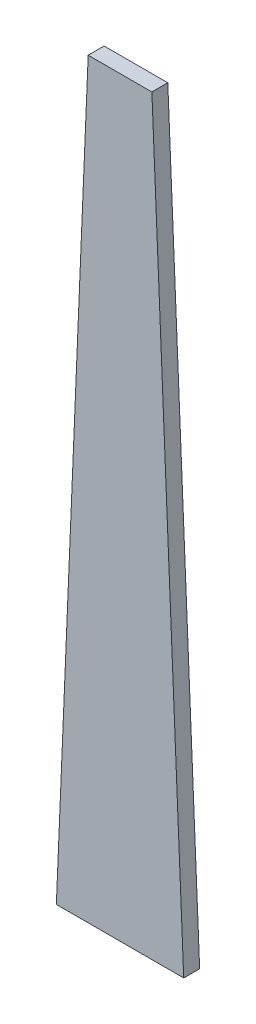
ISO-10303-21;
HEADER;
FILE_DESCRIPTION(('STEP AP214'),'2;1');
FILE_NAME('part.step','',(''),(''),'','','');
FILE_SCHEMA(('AUTOMOTIVE_DESIGN { 1 0 10303 214 1 1 1 1 }'));
ENDSEC;
DATA;
#1=APPLICATION_CONTEXT('core data for automotive mechanical design processes');
#2=APPLICATION_PROTOCOL_DEFINITION('international standard','automotive_design',2000,#1);
#3=PRODUCT_CONTEXT('',#1,'mechanical');
#4=PRODUCT('Part','Part','',(#3));
#5=PRODUCT_RELATED_PRODUCT_CATEGORY('part','',(#4));
#6=PRODUCT_DEFINITION_FORMATION('','',#4);
#7=PRODUCT_DEFINITION_CONTEXT('part definition',#1,'design');
#8=PRODUCT_DEFINITION('design','',#6,#7);
#9=PRODUCT_DEFINITION_SHAPE('','',#8);
#10=(LENGTH_UNIT() NAMED_UNIT(*) SI_UNIT(.MILLI.,.METRE.));
#11=(NAMED_UNIT(*) PLANE_ANGLE_UNIT() SI_UNIT($,.RADIAN.));
#12=(NAMED_UNIT(*) SI_UNIT($,.STERADIAN.) SOLID_ANGLE_UNIT());
#13=UNCERTAINTY_MEASURE_WITH_UNIT(LENGTH_MEASURE(1.E-05),#10,'distance_accuracy_value','');
#14=(GEOMETRIC_REPRESENTATION_CONTEXT(3) GLOBAL_UNCERTAINTY_ASSIGNED_CONTEXT((#13)) GLOBAL_UNIT_ASSIGNED_CONTEXT((#10,
#11,#12)) REPRESENTATION_CONTEXT('',''));
#15=CARTESIAN_POINT('',(0.,0.,0.));
#16=DIRECTION('',(0.,0.,1.));
#17=DIRECTION('',(1.,0.,0.));
#18=AXIS2_PLACEMENT_3D('',#15,#16,#17);
#19=CARTESIAN_POINT('',(-12.7,299.72,6.35));
#20=DIRECTION('',(0.999103476537063,-0.0423348930736044,0.));
#21=DIRECTION('',(0.0423348930736044,0.999103476537064,0.));
#22=AXIS2_PLACEMENT_3D('',#19,#20,#21);
#23=PLANE('',#22);
#24=DIRECTION('',(-0.0423348930736044,-0.999103476537064,0.));
#25=VECTOR('',#24,1.);
#26=CARTESIAN_POINT('',(-12.7,299.72,0.));
#27=LINE('',#26,#25);
#28=CARTESIAN_POINT('',(-12.7,299.72,0.));
#29=VERTEX_POINT('',#28);
#30=CARTESIAN_POINT('',(-25.4,0.,0.));
#31=VERTEX_POINT('',#30);
#32=EDGE_CURVE('E102',#29,#31,#27,.T.);
#33=ORIENTED_EDGE('',*,*,#32,.T.);
#34=DIRECTION('',(0.,0.,-1.));
#35=VECTOR('',#34,1.);
#36=CARTESIAN_POINT('',(-25.4,0.,6.35));
#37=LINE('',#36,#35);
#38=CARTESIAN_POINT('',(-25.4,0.,6.35));
#39=VERTEX_POINT('',#38);
#40=EDGE_CURVE('E11',#39,#31,#37,.T.);
#41=ORIENTED_EDGE('',*,*,#40,.F.);
#42=DIRECTION('',(-0.0423348930736044,-0.999103476537064,0.));
#43=VECTOR('',#42,1.);
#44=CARTESIAN_POINT('',(-12.7,299.72,6.35));
#45=LINE('',#44,#43);
#46=CARTESIAN_POINT('',(-12.7,299.72,6.35));
#47=VERTEX_POINT('',#46);
#48=EDGE_CURVE('E90',#47,#39,#45,.T.);
#49=ORIENTED_EDGE('',*,*,#48,.F.);
#50=DIRECTION('',(0.,0.,-1.));
#51=VECTOR('',#50,1.);
#52=CARTESIAN_POINT('',(-12.7,299.72,6.35));
#53=LINE('',#52,#51);
#54=EDGE_CURVE('E98',#47,#29,#53,.T.);
#55=ORIENTED_EDGE('',*,*,#54,.T.);
#56=EDGE_LOOP('',(#33,#41,#49,#55));
#57=FACE_BOUND('',#56,.T.);
#58=ADVANCED_FACE('F39',(#57),#23,.F.);
#59=CARTESIAN_POINT('',(-25.4,0.,6.35));
#60=DIRECTION('',(0.,1.,0.));
#61=DIRECTION('',(-1.,0.,0.));
#62=AXIS2_PLACEMENT_3D('',#59,#60,#61);
#63=PLANE('',#62);
#64=DIRECTION('',(1.,0.,0.));
#65=VECTOR('',#64,1.);
#66=CARTESIAN_POINT('',(-25.4,0.,0.));
#67=LINE('',#66,#65);
#68=CARTESIAN_POINT('',(25.4,0.,0.));
#69=VERTEX_POINT('',#68);
#70=EDGE_CURVE('E94',#31,#69,#67,.T.);
#71=ORIENTED_EDGE('',*,*,#70,.T.);
#72=DIRECTION('',(0.,0.,-1.));
#73=VECTOR('',#72,1.);
#74=CARTESIAN_POINT('',(25.4,0.,6.35));
#75=LINE('',#74,#73);
#76=CARTESIAN_POINT('',(25.4,0.,6.35));
#77=VERTEX_POINT('',#76);
#78=EDGE_CURVE('E47',#77,#69,#75,.T.);
#79=ORIENTED_EDGE('',*,*,#78,.F.);
#80=DIRECTION('',(1.,0.,0.));
#81=VECTOR('',#80,1.);
#82=CARTESIAN_POINT('',(-25.4,0.,6.35));
#83=LINE('',#82,#81);
#84=EDGE_CURVE('E85',#39,#77,#83,.T.);
#85=ORIENTED_EDGE('',*,*,#84,.F.);
#86=ORIENTED_EDGE('',*,*,#40,.T.);
#87=EDGE_LOOP('',(#71,#79,#85,#86));
#88=FACE_BOUND('',#87,.T.);
#89=ADVANCED_FACE('F93',(#88),#63,.F.);
#90=CARTESIAN_POINT('',(25.4,0.,6.35));
#91=DIRECTION('',(-0.999103476537063,-0.0423348930736044,0.));
#92=DIRECTION('',(0.0423348930736044,-0.999103476537064,0.));
#93=AXIS2_PLACEMENT_3D('',#90,#91,#92);
#94=PLANE('',#93);
#95=DIRECTION('',(-0.0423348930736044,0.999103476537064,0.));
#96=VECTOR('',#95,1.);
#97=CARTESIAN_POINT('',(25.4,0.,0.));
#98=LINE('',#97,#96);
#99=CARTESIAN_POINT('',(12.7,299.72,0.));
#100=VERTEX_POINT('',#99);
#101=EDGE_CURVE('E72',#69,#100,#98,.T.);
#102=ORIENTED_EDGE('',*,*,#101,.T.);
#103=DIRECTION('',(0.,0.,-1.));
#104=VECTOR('',#103,1.);
#105=CARTESIAN_POINT('',(12.7,299.72,6.35));
#106=LINE('',#105,#104);
#107=CARTESIAN_POINT('',(12.7,299.72,6.35));
#108=VERTEX_POINT('',#107);
#109=EDGE_CURVE('E95',#108,#100,#106,.T.);
#110=ORIENTED_EDGE('',*,*,#109,.F.);
#111=DIRECTION('',(-0.0423348930736044,0.999103476537064,0.));
#112=VECTOR('',#111,1.);
#113=CARTESIAN_POINT('',(25.4,0.,6.35));
#114=LINE('',#113,#112);
#115=EDGE_CURVE('E88',#77,#108,#114,.T.);
#116=ORIENTED_EDGE('',*,*,#115,.F.);
#117=ORIENTED_EDGE('',*,*,#78,.T.);
#118=EDGE_LOOP('',(#102,#110,#116,#117));
#119=FACE_BOUND('',#118,.T.);
#120=ADVANCED_FACE('F96',(#119),#94,.F.);
#121=CARTESIAN_POINT('',(12.7,299.72,6.35));
#122=DIRECTION('',(0.,-1.,0.));
#123=DIRECTION('',(0.,0.,-1.));
#124=AXIS2_PLACEMENT_3D('',#121,#122,#123);
#125=PLANE('',#124);
#126=DIRECTION('',(-1.,0.,0.));
#127=VECTOR('',#126,1.);
#128=CARTESIAN_POINT('',(12.7,299.72,0.));
#129=LINE('',#128,#127);
#130=EDGE_CURVE('E78',#100,#29,#129,.T.);
#131=ORIENTED_EDGE('',*,*,#130,.T.);
#132=ORIENTED_EDGE('',*,*,#54,.F.);
#133=DIRECTION('',(-1.,0.,0.));
#134=VECTOR('',#133,1.);
#135=CARTESIAN_POINT('',(12.7,299.72,6.35));
#136=LINE('',#135,#134);
#137=EDGE_CURVE('E55',#108,#47,#136,.T.);
#138=ORIENTED_EDGE('',*,*,#137,.F.);
#139=ORIENTED_EDGE('',*,*,#109,.T.);
#140=EDGE_LOOP('',(#131,#132,#138,#139));
#141=FACE_BOUND('',#140,.T.);
#142=ADVANCED_FACE('F109',(#141),#125,.F.);
#143=CARTESIAN_POINT('',(0.,0.,6.35));
#144=DIRECTION('',(0.,0.,1.));
#145=DIRECTION('',(1.,0.,0.));
#146=AXIS2_PLACEMENT_3D('',#143,#144,#145);
#147=PLANE('',#146);
#148=ORIENTED_EDGE('',*,*,#48,.T.);
#149=ORIENTED_EDGE('',*,*,#84,.T.);
#150=ORIENTED_EDGE('',*,*,#115,.T.);
#151=ORIENTED_EDGE('',*,*,#137,.T.);
#152=EDGE_LOOP('',(#148,#149,#150,#151));
#153=FACE_BOUND('',#152,.T.);
#154=ADVANCED_FACE('F86',(#153),#147,.T.);
#155=CARTESIAN_POINT('',(0.,0.,0.));
#156=DIRECTION('',(0.,0.,1.));
#157=DIRECTION('',(1.,0.,0.));
#158=AXIS2_PLACEMENT_3D('',#155,#156,#157);
#159=PLANE('',#158);
#160=ORIENTED_EDGE('',*,*,#32,.F.);
#161=ORIENTED_EDGE('',*,*,#130,.F.);
#162=ORIENTED_EDGE('',*,*,#101,.F.);
#163=ORIENTED_EDGE('',*,*,#70,.F.);
#164=EDGE_LOOP('',(#160,#161,#162,#163));
#165=FACE_BOUND('',#164,.T.);
#166=ADVANCED_FACE('F112',(#165),#159,.F.);
#167=CLOSED_SHELL('',(#58,#89,#120,#142,#154,#166));
#168=MANIFOLD_SOLID_BREP('B2',#167);
#169=ADVANCED_BREP_SHAPE_REPRESENTATION('',(#18,#168),#14);
#170=SHAPE_DEFINITION_REPRESENTATION(#9,#169);
ENDSEC;
END-ISO-10303-21;
